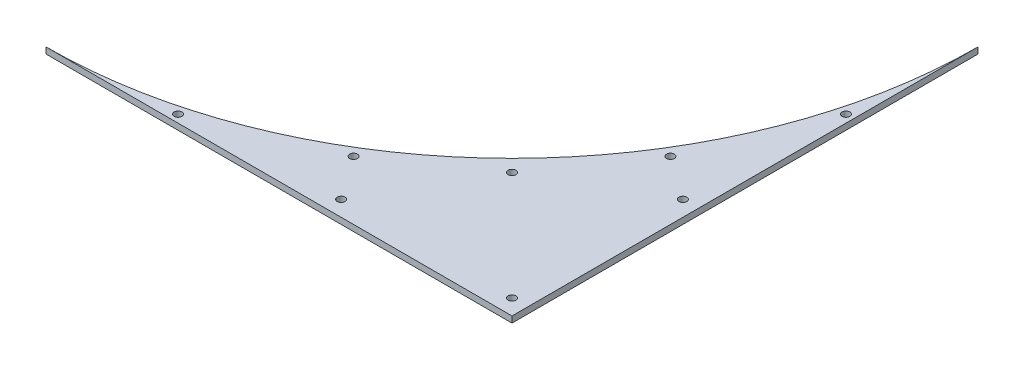
ISO-10303-21;
HEADER;
FILE_DESCRIPTION(('STEP AP214'),'2;1');
FILE_NAME('part.step','',(''),(''),'','','');
FILE_SCHEMA(('AUTOMOTIVE_DESIGN { 1 0 10303 214 1 1 1 1 }'));
ENDSEC;
DATA;
#1=APPLICATION_CONTEXT('core data for automotive mechanical design processes');
#2=APPLICATION_PROTOCOL_DEFINITION('international standard','automotive_design',2000,#1);
#3=PRODUCT_CONTEXT('',#1,'mechanical');
#4=PRODUCT('Part','Part','',(#3));
#5=PRODUCT_RELATED_PRODUCT_CATEGORY('part','',(#4));
#6=PRODUCT_DEFINITION_FORMATION('','',#4);
#7=PRODUCT_DEFINITION_CONTEXT('part definition',#1,'design');
#8=PRODUCT_DEFINITION('design','',#6,#7);
#9=PRODUCT_DEFINITION_SHAPE('','',#8);
#10=(LENGTH_UNIT() NAMED_UNIT(*) SI_UNIT(.MILLI.,.METRE.));
#11=(NAMED_UNIT(*) PLANE_ANGLE_UNIT() SI_UNIT($,.RADIAN.));
#12=(NAMED_UNIT(*) SI_UNIT($,.STERADIAN.) SOLID_ANGLE_UNIT());
#13=UNCERTAINTY_MEASURE_WITH_UNIT(LENGTH_MEASURE(1.E-05),#10,'distance_accuracy_value','');
#14=(GEOMETRIC_REPRESENTATION_CONTEXT(3) GLOBAL_UNCERTAINTY_ASSIGNED_CONTEXT((#13)) GLOBAL_UNIT_ASSIGNED_CONTEXT((#10,
#11,#12)) REPRESENTATION_CONTEXT('',''));
#15=CARTESIAN_POINT('',(0.,0.,0.));
#16=DIRECTION('',(0.,0.,1.));
#17=DIRECTION('',(1.,0.,0.));
#18=AXIS2_PLACEMENT_3D('',#15,#16,#17);
#19=CARTESIAN_POINT('',(381.,5.08,0.));
#20=DIRECTION('',(-1.,0.,0.));
#21=DIRECTION('',(0.,0.,1.));
#22=AXIS2_PLACEMENT_3D('',#19,#20,#21);
#23=PLANE('',#22);
#24=DIRECTION('',(0.,0.,-1.));
#25=VECTOR('',#24,1.);
#26=CARTESIAN_POINT('',(381.,0.,0.));
#27=LINE('',#26,#25);
#28=CARTESIAN_POINT('',(381.,0.,0.));
#29=VERTEX_POINT('',#28);
#30=CARTESIAN_POINT('',(381.,0.,-381.));
#31=VERTEX_POINT('',#30);
#32=EDGE_CURVE('E81',#29,#31,#27,.T.);
#33=ORIENTED_EDGE('',*,*,#32,.T.);
#34=DIRECTION('',(0.,-1.,0.));
#35=VECTOR('',#34,1.);
#36=CARTESIAN_POINT('',(381.,5.08,-381.));
#37=LINE('',#36,#35);
#38=CARTESIAN_POINT('',(381.,5.08,-381.));
#39=VERTEX_POINT('',#38);
#40=EDGE_CURVE('E11',#39,#31,#37,.T.);
#41=ORIENTED_EDGE('',*,*,#40,.F.);
#42=DIRECTION('',(0.,0.,-1.));
#43=VECTOR('',#42,1.);
#44=CARTESIAN_POINT('',(381.,5.08,0.));
#45=LINE('',#44,#43);
#46=CARTESIAN_POINT('',(381.,5.08,0.));
#47=VERTEX_POINT('',#46);
#48=EDGE_CURVE('E74',#47,#39,#45,.T.);
#49=ORIENTED_EDGE('',*,*,#48,.F.);
#50=DIRECTION('',(0.,-1.,0.));
#51=VECTOR('',#50,1.);
#52=CARTESIAN_POINT('',(381.,5.08,0.));
#53=LINE('',#52,#51);
#54=EDGE_CURVE('E82',#47,#29,#53,.T.);
#55=ORIENTED_EDGE('',*,*,#54,.T.);
#56=EDGE_LOOP('',(#33,#41,#49,#55));
#57=FACE_BOUND('',#56,.T.);
#58=ADVANCED_FACE('F34',(#57),#23,.F.);
#59=CARTESIAN_POINT('',(0.,5.08,-381.));
#60=DIRECTION('',(0.,-1.,0.));
#61=DIRECTION('',(0.,0.,-1.));
#62=AXIS2_PLACEMENT_3D('',#59,#60,#61);
#63=CYLINDRICAL_SURFACE('',#62,381.);
#64=CARTESIAN_POINT('',(0.,0.,-381.));
#65=DIRECTION('',(0.,1.,0.));
#66=DIRECTION('',(0.,0.,1.));
#67=AXIS2_PLACEMENT_3D('',#64,#65,#66);
#68=CIRCLE('',#67,381.);
#69=CARTESIAN_POINT('',(0.,0.,0.));
#70=VERTEX_POINT('',#69);
#71=EDGE_CURVE('E62',#31,#70,#68,.F.);
#72=ORIENTED_EDGE('',*,*,#71,.T.);
#73=DIRECTION('',(0.,-1.,0.));
#74=VECTOR('',#73,1.);
#75=CARTESIAN_POINT('',(0.,5.08,0.));
#76=LINE('',#75,#74);
#77=CARTESIAN_POINT('',(0.,5.08,0.));
#78=VERTEX_POINT('',#77);
#79=EDGE_CURVE('E42',#78,#70,#76,.T.);
#80=ORIENTED_EDGE('',*,*,#79,.F.);
#81=CARTESIAN_POINT('',(0.,5.08,-381.));
#82=DIRECTION('',(0.,1.,0.));
#83=DIRECTION('',(0.,0.,1.));
#84=AXIS2_PLACEMENT_3D('',#81,#82,#83);
#85=CIRCLE('',#84,381.);
#86=EDGE_CURVE('E70',#39,#78,#85,.F.);
#87=ORIENTED_EDGE('',*,*,#86,.F.);
#88=ORIENTED_EDGE('',*,*,#40,.T.);
#89=EDGE_LOOP('',(#72,#80,#87,#88));
#90=FACE_BOUND('',#89,.T.);
#91=ADVANCED_FACE('F71',(#90),#63,.F.);
#92=CARTESIAN_POINT('',(0.,5.08,0.));
#93=DIRECTION('',(0.,0.,-1.));
#94=DIRECTION('',(-1.,0.,0.));
#95=AXIS2_PLACEMENT_3D('',#92,#93,#94);
#96=PLANE('',#95);
#97=DIRECTION('',(1.,0.,0.));
#98=VECTOR('',#97,1.);
#99=CARTESIAN_POINT('',(0.,0.,0.));
#100=LINE('',#99,#98);
#101=EDGE_CURVE('E67',#70,#29,#100,.T.);
#102=ORIENTED_EDGE('',*,*,#101,.T.);
#103=ORIENTED_EDGE('',*,*,#54,.F.);
#104=DIRECTION('',(1.,0.,0.));
#105=VECTOR('',#104,1.);
#106=CARTESIAN_POINT('',(0.,5.08,0.));
#107=LINE('',#106,#105);
#108=EDGE_CURVE('E50',#78,#47,#107,.T.);
#109=ORIENTED_EDGE('',*,*,#108,.F.);
#110=ORIENTED_EDGE('',*,*,#79,.T.);
#111=EDGE_LOOP('',(#102,#103,#109,#110));
#112=FACE_BOUND('',#111,.T.);
#113=ADVANCED_FACE('F93',(#112),#96,.F.);
#114=CARTESIAN_POINT('',(0.,5.08,0.));
#115=DIRECTION('',(0.,1.,0.));
#116=DIRECTION('',(0.,0.,1.));
#117=AXIS2_PLACEMENT_3D('',#114,#115,#116);
#118=PLANE('',#117);
#119=CARTESIAN_POINT('',(368.3,5.08,-152.4));
#120=DIRECTION('',(0.,1.,0.));
#121=DIRECTION('',(0.,0.,1.));
#122=AXIS2_PLACEMENT_3D('',#119,#120,#121);
#123=CIRCLE('',#122,3.17499999999997);
#124=CARTESIAN_POINT('',(368.3,5.08,-149.225));
#125=VERTEX_POINT('',#124);
#126=EDGE_CURVE('E212',#125,#125,#123,.T.);
#127=ORIENTED_EDGE('',*,*,#126,.F.);
#128=EDGE_LOOP('',(#127));
#129=FACE_BOUND('',#128,.T.);
#130=CARTESIAN_POINT('',(228.6,5.08,-12.7));
#131=DIRECTION('',(0.,1.,0.));
#132=DIRECTION('',(0.,0.,1.));
#133=AXIS2_PLACEMENT_3D('',#130,#131,#132);
#134=CIRCLE('',#133,3.175);
#135=CARTESIAN_POINT('',(228.6,5.08,-9.525));
#136=VERTEX_POINT('',#135);
#137=EDGE_CURVE('E214',#136,#136,#134,.T.);
#138=ORIENTED_EDGE('',*,*,#137,.F.);
#139=EDGE_LOOP('',(#138));
#140=FACE_BOUND('',#139,.T.);
#141=CARTESIAN_POINT('',(332.74,5.08,-177.8));
#142=DIRECTION('',(0.,1.,0.));
#143=DIRECTION('',(0.,0.,1.));
#144=AXIS2_PLACEMENT_3D('',#141,#142,#143);
#145=CIRCLE('',#144,3.17499999999997);
#146=CARTESIAN_POINT('',(332.74,5.08,-174.625));
#147=VERTEX_POINT('',#146);
#148=EDGE_CURVE('E220',#147,#147,#145,.T.);
#149=ORIENTED_EDGE('',*,*,#148,.F.);
#150=EDGE_LOOP('',(#149));
#151=FACE_BOUND('',#150,.T.);
#152=CARTESIAN_POINT('',(203.2,5.08,-48.26));
#153=DIRECTION('',(0.,1.,0.));
#154=DIRECTION('',(0.,0.,1.));
#155=AXIS2_PLACEMENT_3D('',#152,#153,#154);
#156=CIRCLE('',#155,3.175);
#157=CARTESIAN_POINT('',(203.2,5.08,-45.085));
#158=VERTEX_POINT('',#157);
#159=EDGE_CURVE('E226',#158,#158,#156,.T.);
#160=ORIENTED_EDGE('',*,*,#159,.F.);
#161=EDGE_LOOP('',(#160));
#162=FACE_BOUND('',#161,.T.);
#163=CARTESIAN_POINT('',(279.4,5.08,-101.6));
#164=DIRECTION('',(0.,1.,0.));
#165=DIRECTION('',(0.,0.,1.));
#166=AXIS2_PLACEMENT_3D('',#163,#164,#165);
#167=CIRCLE('',#166,3.17499999999997);
#168=CARTESIAN_POINT('',(279.4,5.08,-98.425));
#169=VERTEX_POINT('',#168);
#170=EDGE_CURVE('E232',#169,#169,#167,.T.);
#171=ORIENTED_EDGE('',*,*,#170,.F.);
#172=EDGE_LOOP('',(#171));
#173=FACE_BOUND('',#172,.T.);
#174=CARTESIAN_POINT('',(368.3,5.08,-12.7));
#175=DIRECTION('',(0.,1.,0.));
#176=DIRECTION('',(0.,0.,1.));
#177=AXIS2_PLACEMENT_3D('',#174,#175,#176);
#178=CIRCLE('',#177,3.17499999999997);
#179=CARTESIAN_POINT('',(368.3,5.08,-9.52500000000003));
#180=VERTEX_POINT('',#179);
#181=EDGE_CURVE('E238',#180,#180,#178,.T.);
#182=ORIENTED_EDGE('',*,*,#181,.F.);
#183=EDGE_LOOP('',(#182));
#184=FACE_BOUND('',#183,.T.);
#185=CARTESIAN_POINT('',(374.65,5.08,-279.4));
#186=DIRECTION('',(0.,1.,0.));
#187=DIRECTION('',(0.,0.,1.));
#188=AXIS2_PLACEMENT_3D('',#185,#186,#187);
#189=CIRCLE('',#188,3.17499999999997);
#190=CARTESIAN_POINT('',(374.65,5.08,-276.225));
#191=VERTEX_POINT('',#190);
#192=EDGE_CURVE('E244',#191,#191,#189,.T.);
#193=ORIENTED_EDGE('',*,*,#192,.F.);
#194=EDGE_LOOP('',(#193));
#195=FACE_BOUND('',#194,.T.);
#196=CARTESIAN_POINT('',(101.6,5.08,-6.35));
#197=DIRECTION('',(0.,1.,0.));
#198=DIRECTION('',(0.,0.,1.));
#199=AXIS2_PLACEMENT_3D('',#196,#197,#198);
#200=CIRCLE('',#199,3.175);
#201=CARTESIAN_POINT('',(101.6,5.08,-3.175));
#202=VERTEX_POINT('',#201);
#203=EDGE_CURVE('E88',#202,#202,#200,.T.);
#204=ORIENTED_EDGE('',*,*,#203,.F.);
#205=EDGE_LOOP('',(#204));
#206=FACE_BOUND('',#205,.T.);
#207=ORIENTED_EDGE('',*,*,#48,.T.);
#208=ORIENTED_EDGE('',*,*,#86,.T.);
#209=ORIENTED_EDGE('',*,*,#108,.T.);
#210=EDGE_LOOP('',(#207,#208,#209));
#211=FACE_BOUND('',#210,.T.);
#212=ADVANCED_FACE('F77',(#129,#140,#151,#162,#173,#184,#195,#206,#211),#118,.T.);
#213=CARTESIAN_POINT('',(0.,0.,0.));
#214=DIRECTION('',(0.,1.,0.));
#215=DIRECTION('',(0.,0.,1.));
#216=AXIS2_PLACEMENT_3D('',#213,#214,#215);
#217=PLANE('',#216);
#218=CARTESIAN_POINT('',(368.3,0.,-152.4));
#219=DIRECTION('',(0.,1.,0.));
#220=DIRECTION('',(0.,0.,1.));
#221=AXIS2_PLACEMENT_3D('',#218,#219,#220);
#222=CIRCLE('',#221,3.17499999999997);
#223=CARTESIAN_POINT('',(368.3,0.,-149.225));
#224=VERTEX_POINT('',#223);
#225=EDGE_CURVE('E209',#224,#224,#222,.T.);
#226=ORIENTED_EDGE('',*,*,#225,.T.);
#227=EDGE_LOOP('',(#226));
#228=FACE_BOUND('',#227,.T.);
#229=CARTESIAN_POINT('',(228.6,0.,-12.7));
#230=DIRECTION('',(0.,1.,0.));
#231=DIRECTION('',(0.,0.,1.));
#232=AXIS2_PLACEMENT_3D('',#229,#230,#231);
#233=CIRCLE('',#232,3.175);
#234=CARTESIAN_POINT('',(228.6,0.,-9.525));
#235=VERTEX_POINT('',#234);
#236=EDGE_CURVE('E217',#235,#235,#233,.T.);
#237=ORIENTED_EDGE('',*,*,#236,.T.);
#238=EDGE_LOOP('',(#237));
#239=FACE_BOUND('',#238,.T.);
#240=CARTESIAN_POINT('',(332.74,0.,-177.8));
#241=DIRECTION('',(0.,1.,0.));
#242=DIRECTION('',(0.,0.,1.));
#243=AXIS2_PLACEMENT_3D('',#240,#241,#242);
#244=CIRCLE('',#243,3.17499999999997);
#245=CARTESIAN_POINT('',(332.74,0.,-174.625));
#246=VERTEX_POINT('',#245);
#247=EDGE_CURVE('E223',#246,#246,#244,.T.);
#248=ORIENTED_EDGE('',*,*,#247,.T.);
#249=EDGE_LOOP('',(#248));
#250=FACE_BOUND('',#249,.T.);
#251=CARTESIAN_POINT('',(203.2,0.,-48.26));
#252=DIRECTION('',(0.,1.,0.));
#253=DIRECTION('',(0.,0.,1.));
#254=AXIS2_PLACEMENT_3D('',#251,#252,#253);
#255=CIRCLE('',#254,3.175);
#256=CARTESIAN_POINT('',(203.2,0.,-45.085));
#257=VERTEX_POINT('',#256);
#258=EDGE_CURVE('E229',#257,#257,#255,.T.);
#259=ORIENTED_EDGE('',*,*,#258,.T.);
#260=EDGE_LOOP('',(#259));
#261=FACE_BOUND('',#260,.T.);
#262=CARTESIAN_POINT('',(279.4,0.,-101.6));
#263=DIRECTION('',(0.,1.,0.));
#264=DIRECTION('',(0.,0.,1.));
#265=AXIS2_PLACEMENT_3D('',#262,#263,#264);
#266=CIRCLE('',#265,3.17499999999997);
#267=CARTESIAN_POINT('',(279.4,0.,-98.425));
#268=VERTEX_POINT('',#267);
#269=EDGE_CURVE('E235',#268,#268,#266,.T.);
#270=ORIENTED_EDGE('',*,*,#269,.T.);
#271=EDGE_LOOP('',(#270));
#272=FACE_BOUND('',#271,.T.);
#273=CARTESIAN_POINT('',(368.3,0.,-12.7));
#274=DIRECTION('',(0.,1.,0.));
#275=DIRECTION('',(0.,0.,1.));
#276=AXIS2_PLACEMENT_3D('',#273,#274,#275);
#277=CIRCLE('',#276,3.17499999999997);
#278=CARTESIAN_POINT('',(368.3,0.,-9.52500000000003));
#279=VERTEX_POINT('',#278);
#280=EDGE_CURVE('E241',#279,#279,#277,.T.);
#281=ORIENTED_EDGE('',*,*,#280,.T.);
#282=EDGE_LOOP('',(#281));
#283=FACE_BOUND('',#282,.T.);
#284=CARTESIAN_POINT('',(374.65,0.,-279.4));
#285=DIRECTION('',(0.,1.,0.));
#286=DIRECTION('',(0.,0.,1.));
#287=AXIS2_PLACEMENT_3D('',#284,#285,#286);
#288=CIRCLE('',#287,3.17499999999997);
#289=CARTESIAN_POINT('',(374.65,0.,-276.225));
#290=VERTEX_POINT('',#289);
#291=EDGE_CURVE('E247',#290,#290,#288,.T.);
#292=ORIENTED_EDGE('',*,*,#291,.T.);
#293=EDGE_LOOP('',(#292));
#294=FACE_BOUND('',#293,.T.);
#295=CARTESIAN_POINT('',(101.6,0.,-6.35));
#296=DIRECTION('',(0.,1.,0.));
#297=DIRECTION('',(0.,0.,1.));
#298=AXIS2_PLACEMENT_3D('',#295,#296,#297);
#299=CIRCLE('',#298,3.175);
#300=CARTESIAN_POINT('',(101.6,0.,-3.175));
#301=VERTEX_POINT('',#300);
#302=EDGE_CURVE('E84',#301,#301,#299,.T.);
#303=ORIENTED_EDGE('',*,*,#302,.T.);
#304=EDGE_LOOP('',(#303));
#305=FACE_BOUND('',#304,.T.);
#306=ORIENTED_EDGE('',*,*,#32,.F.);
#307=ORIENTED_EDGE('',*,*,#101,.F.);
#308=ORIENTED_EDGE('',*,*,#71,.F.);
#309=EDGE_LOOP('',(#306,#307,#308));
#310=FACE_BOUND('',#309,.T.);
#311=ADVANCED_FACE('F94',(#228,#239,#250,#261,#272,#283,#294,#305,#310),#217,.F.);
#312=CARTESIAN_POINT('',(101.6,0.,-6.35));
#313=DIRECTION('',(0.,1.,0.));
#314=DIRECTION('',(0.,0.,1.));
#315=AXIS2_PLACEMENT_3D('',#312,#313,#314);
#316=CYLINDRICAL_SURFACE('',#315,3.175);
#317=ORIENTED_EDGE('',*,*,#302,.F.);
#318=EDGE_LOOP('',(#317));
#319=FACE_BOUND('',#318,.T.);
#320=ORIENTED_EDGE('',*,*,#203,.T.);
#321=EDGE_LOOP('',(#320));
#322=FACE_BOUND('',#321,.T.);
#323=ADVANCED_FACE('F96',(#319,#322),#316,.F.);
#324=CARTESIAN_POINT('',(374.65,0.,-279.4));
#325=DIRECTION('',(0.,1.,0.));
#326=DIRECTION('',(0.,0.,1.));
#327=AXIS2_PLACEMENT_3D('',#324,#325,#326);
#328=CYLINDRICAL_SURFACE('',#327,3.17499999999997);
#329=ORIENTED_EDGE('',*,*,#291,.F.);
#330=EDGE_LOOP('',(#329));
#331=FACE_BOUND('',#330,.T.);
#332=ORIENTED_EDGE('',*,*,#192,.T.);
#333=EDGE_LOOP('',(#332));
#334=FACE_BOUND('',#333,.T.);
#335=ADVANCED_FACE('F103',(#331,#334),#328,.F.);
#336=CARTESIAN_POINT('',(368.3,0.,-12.7));
#337=DIRECTION('',(0.,1.,0.));
#338=DIRECTION('',(0.,0.,1.));
#339=AXIS2_PLACEMENT_3D('',#336,#337,#338);
#340=CYLINDRICAL_SURFACE('',#339,3.17499999999997);
#341=ORIENTED_EDGE('',*,*,#280,.F.);
#342=EDGE_LOOP('',(#341));
#343=FACE_BOUND('',#342,.T.);
#344=ORIENTED_EDGE('',*,*,#181,.T.);
#345=EDGE_LOOP('',(#344));
#346=FACE_BOUND('',#345,.T.);
#347=ADVANCED_FACE('F143',(#343,#346),#340,.F.);
#348=CARTESIAN_POINT('',(279.4,0.,-101.6));
#349=DIRECTION('',(0.,1.,0.));
#350=DIRECTION('',(0.,0.,1.));
#351=AXIS2_PLACEMENT_3D('',#348,#349,#350);
#352=CYLINDRICAL_SURFACE('',#351,3.17499999999997);
#353=ORIENTED_EDGE('',*,*,#269,.F.);
#354=EDGE_LOOP('',(#353));
#355=FACE_BOUND('',#354,.T.);
#356=ORIENTED_EDGE('',*,*,#170,.T.);
#357=EDGE_LOOP('',(#356));
#358=FACE_BOUND('',#357,.T.);
#359=ADVANCED_FACE('F153',(#355,#358),#352,.F.);
#360=CARTESIAN_POINT('',(203.2,0.,-48.26));
#361=DIRECTION('',(0.,1.,0.));
#362=DIRECTION('',(0.,0.,1.));
#363=AXIS2_PLACEMENT_3D('',#360,#361,#362);
#364=CYLINDRICAL_SURFACE('',#363,3.175);
#365=ORIENTED_EDGE('',*,*,#258,.F.);
#366=EDGE_LOOP('',(#365));
#367=FACE_BOUND('',#366,.T.);
#368=ORIENTED_EDGE('',*,*,#159,.T.);
#369=EDGE_LOOP('',(#368));
#370=FACE_BOUND('',#369,.T.);
#371=ADVANCED_FACE('F163',(#367,#370),#364,.F.);
#372=CARTESIAN_POINT('',(332.74,0.,-177.8));
#373=DIRECTION('',(0.,1.,0.));
#374=DIRECTION('',(0.,0.,1.));
#375=AXIS2_PLACEMENT_3D('',#372,#373,#374);
#376=CYLINDRICAL_SURFACE('',#375,3.17499999999997);
#377=ORIENTED_EDGE('',*,*,#247,.F.);
#378=EDGE_LOOP('',(#377));
#379=FACE_BOUND('',#378,.T.);
#380=ORIENTED_EDGE('',*,*,#148,.T.);
#381=EDGE_LOOP('',(#380));
#382=FACE_BOUND('',#381,.T.);
#383=ADVANCED_FACE('F173',(#379,#382),#376,.F.);
#384=CARTESIAN_POINT('',(228.6,0.,-12.7));
#385=DIRECTION('',(0.,1.,0.));
#386=DIRECTION('',(0.,0.,1.));
#387=AXIS2_PLACEMENT_3D('',#384,#385,#386);
#388=CYLINDRICAL_SURFACE('',#387,3.175);
#389=ORIENTED_EDGE('',*,*,#236,.F.);
#390=EDGE_LOOP('',(#389));
#391=FACE_BOUND('',#390,.T.);
#392=ORIENTED_EDGE('',*,*,#137,.T.);
#393=EDGE_LOOP('',(#392));
#394=FACE_BOUND('',#393,.T.);
#395=ADVANCED_FACE('F183',(#391,#394),#388,.F.);
#396=CARTESIAN_POINT('',(368.3,0.,-152.4));
#397=DIRECTION('',(0.,1.,0.));
#398=DIRECTION('',(0.,0.,1.));
#399=AXIS2_PLACEMENT_3D('',#396,#397,#398);
#400=CYLINDRICAL_SURFACE('',#399,3.17499999999997);
#401=ORIENTED_EDGE('',*,*,#225,.F.);
#402=EDGE_LOOP('',(#401));
#403=FACE_BOUND('',#402,.T.);
#404=ORIENTED_EDGE('',*,*,#126,.T.);
#405=EDGE_LOOP('',(#404));
#406=FACE_BOUND('',#405,.T.);
#407=ADVANCED_FACE('F193',(#403,#406),#400,.F.);
#408=CLOSED_SHELL('',(#58,#91,#113,#212,#311,#323,#335,#347,#359,#371,#383,#395,#407));
#409=MANIFOLD_SOLID_BREP('B2',#408);
#410=ADVANCED_BREP_SHAPE_REPRESENTATION('',(#18,#409),#14);
#411=SHAPE_DEFINITION_REPRESENTATION(#9,#410);
ENDSEC;
END-ISO-10303-21;
